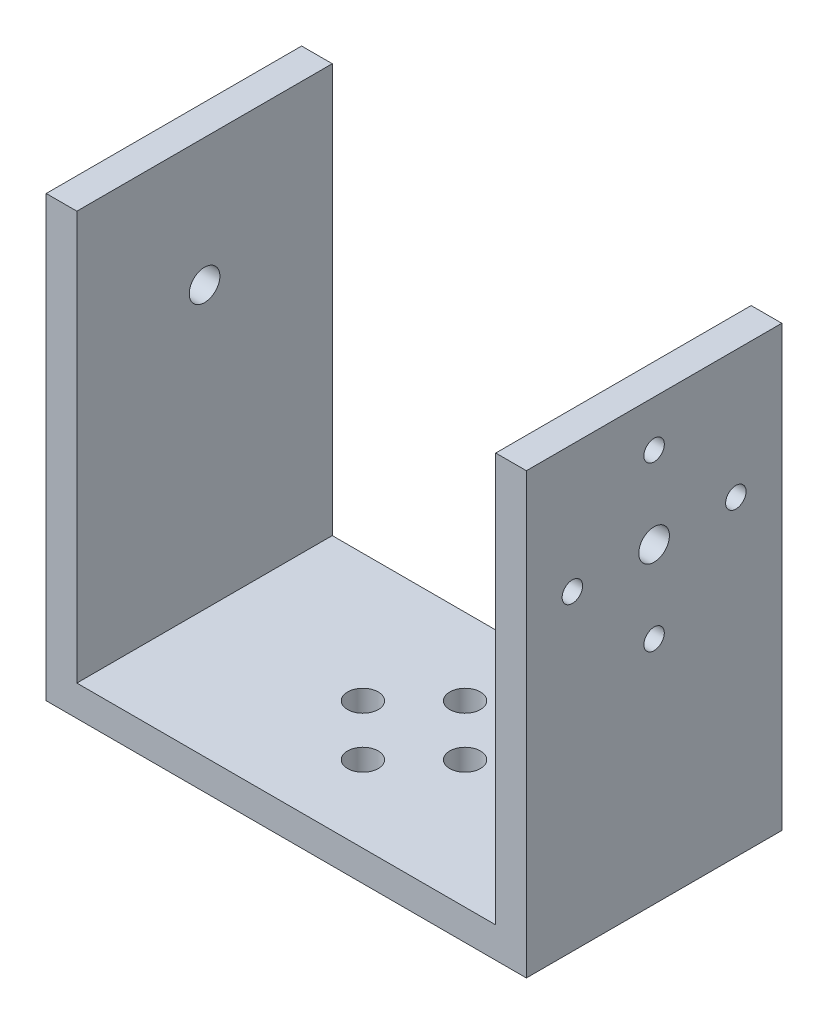
ISO-10303-21;
HEADER;
FILE_DESCRIPTION(('STEP AP214'),'2;1');
FILE_NAME('part.step','',(''),(''),'','','');
FILE_SCHEMA(('AUTOMOTIVE_DESIGN { 1 0 10303 214 1 1 1 1 }'));
ENDSEC;
DATA;
#1=APPLICATION_CONTEXT('core data for automotive mechanical design processes');
#2=APPLICATION_PROTOCOL_DEFINITION('international standard','automotive_design',2000,#1);
#3=PRODUCT_CONTEXT('',#1,'mechanical');
#4=PRODUCT('Part','Part','',(#3));
#5=PRODUCT_RELATED_PRODUCT_CATEGORY('part','',(#4));
#6=PRODUCT_DEFINITION_FORMATION('','',#4);
#7=PRODUCT_DEFINITION_CONTEXT('part definition',#1,'design');
#8=PRODUCT_DEFINITION('design','',#6,#7);
#9=PRODUCT_DEFINITION_SHAPE('','',#8);
#10=(LENGTH_UNIT() NAMED_UNIT(*) SI_UNIT(.MILLI.,.METRE.));
#11=(NAMED_UNIT(*) PLANE_ANGLE_UNIT() SI_UNIT($,.RADIAN.));
#12=(NAMED_UNIT(*) SI_UNIT($,.STERADIAN.) SOLID_ANGLE_UNIT());
#13=UNCERTAINTY_MEASURE_WITH_UNIT(LENGTH_MEASURE(1.E-05),#10,'distance_accuracy_value','');
#14=(GEOMETRIC_REPRESENTATION_CONTEXT(3) GLOBAL_UNCERTAINTY_ASSIGNED_CONTEXT((#13)) GLOBAL_UNIT_ASSIGNED_CONTEXT((#10,
#11,#12)) REPRESENTATION_CONTEXT('',''));
#15=CARTESIAN_POINT('',(0.,0.,0.));
#16=DIRECTION('',(0.,0.,1.));
#17=DIRECTION('',(1.,0.,0.));
#18=AXIS2_PLACEMENT_3D('',#15,#16,#17);
#19=CARTESIAN_POINT('',(0.,0.,0.));
#20=DIRECTION('',(1.,0.,0.));
#21=DIRECTION('',(0.,0.,-1.));
#22=AXIS2_PLACEMENT_3D('',#19,#20,#21);
#23=CYLINDRICAL_SURFACE('',#22,1.5);
#24=CARTESIAN_POINT('',(0.,0.,0.));
#25=DIRECTION('',(1.,0.,0.));
#26=DIRECTION('',(0.,0.,-1.));
#27=AXIS2_PLACEMENT_3D('',#24,#25,#26);
#28=CIRCLE('',#27,1.5);
#29=CARTESIAN_POINT('',(0.,0.,-1.5));
#30=VERTEX_POINT('',#29);
#31=EDGE_CURVE('E20',#30,#30,#28,.F.);
#32=ORIENTED_EDGE('',*,*,#31,.T.);
#33=EDGE_LOOP('',(#32));
#34=FACE_BOUND('',#33,.T.);
#35=CARTESIAN_POINT('',(3.,0.,0.));
#36=DIRECTION('',(1.,0.,0.));
#37=DIRECTION('',(0.,0.,-1.));
#38=AXIS2_PLACEMENT_3D('',#35,#36,#37);
#39=CIRCLE('',#38,1.5);
#40=CARTESIAN_POINT('',(3.,0.,-1.5));
#41=VERTEX_POINT('',#40);
#42=EDGE_CURVE('E113',#41,#41,#39,.F.);
#43=ORIENTED_EDGE('',*,*,#42,.F.);
#44=EDGE_LOOP('',(#43));
#45=FACE_BOUND('',#44,.T.);
#46=ADVANCED_FACE('F17',(#34,#45),#23,.F.);
#47=CARTESIAN_POINT('',(0.,8.,0.));
#48=DIRECTION('',(1.,0.,0.));
#49=DIRECTION('',(0.,0.,-1.));
#50=AXIS2_PLACEMENT_3D('',#47,#48,#49);
#51=CYLINDRICAL_SURFACE('',#50,1.);
#52=CARTESIAN_POINT('',(0.,8.,0.));
#53=DIRECTION('',(1.,0.,0.));
#54=DIRECTION('',(0.,0.,-1.));
#55=AXIS2_PLACEMENT_3D('',#52,#53,#54);
#56=CIRCLE('',#55,1.);
#57=CARTESIAN_POINT('',(0.,8.,-1.));
#58=VERTEX_POINT('',#57);
#59=EDGE_CURVE('E168',#58,#58,#56,.F.);
#60=ORIENTED_EDGE('',*,*,#59,.T.);
#61=EDGE_LOOP('',(#60));
#62=FACE_BOUND('',#61,.T.);
#63=CARTESIAN_POINT('',(3.,8.,0.));
#64=DIRECTION('',(1.,0.,0.));
#65=DIRECTION('',(0.,0.,-1.));
#66=AXIS2_PLACEMENT_3D('',#63,#64,#65);
#67=CIRCLE('',#66,1.);
#68=CARTESIAN_POINT('',(3.,8.,-1.));
#69=VERTEX_POINT('',#68);
#70=EDGE_CURVE('E154',#69,#69,#67,.F.);
#71=ORIENTED_EDGE('',*,*,#70,.F.);
#72=EDGE_LOOP('',(#71));
#73=FACE_BOUND('',#72,.T.);
#74=ADVANCED_FACE('F402',(#62,#73),#51,.F.);
#75=CARTESIAN_POINT('',(0.,0.,-8.));
#76=DIRECTION('',(1.,0.,0.));
#77=DIRECTION('',(0.,0.,-1.));
#78=AXIS2_PLACEMENT_3D('',#75,#76,#77);
#79=CYLINDRICAL_SURFACE('',#78,1.);
#80=CARTESIAN_POINT('',(0.,0.,-8.));
#81=DIRECTION('',(1.,0.,0.));
#82=DIRECTION('',(0.,0.,-1.));
#83=AXIS2_PLACEMENT_3D('',#80,#81,#82);
#84=CIRCLE('',#83,1.);
#85=CARTESIAN_POINT('',(0.,0.,-9.));
#86=VERTEX_POINT('',#85);
#87=EDGE_CURVE('E166',#86,#86,#84,.F.);
#88=ORIENTED_EDGE('',*,*,#87,.T.);
#89=EDGE_LOOP('',(#88));
#90=FACE_BOUND('',#89,.T.);
#91=CARTESIAN_POINT('',(3.,0.,-8.));
#92=DIRECTION('',(1.,0.,0.));
#93=DIRECTION('',(0.,0.,-1.));
#94=AXIS2_PLACEMENT_3D('',#91,#92,#93);
#95=CIRCLE('',#94,1.);
#96=CARTESIAN_POINT('',(3.,0.,-9.));
#97=VERTEX_POINT('',#96);
#98=EDGE_CURVE('E151',#97,#97,#95,.F.);
#99=ORIENTED_EDGE('',*,*,#98,.F.);
#100=EDGE_LOOP('',(#99));
#101=FACE_BOUND('',#100,.T.);
#102=ADVANCED_FACE('F393',(#90,#101),#79,.F.);
#103=CARTESIAN_POINT('',(0.,-8.,0.));
#104=DIRECTION('',(1.,0.,0.));
#105=DIRECTION('',(0.,0.,-1.));
#106=AXIS2_PLACEMENT_3D('',#103,#104,#105);
#107=CYLINDRICAL_SURFACE('',#106,1.);
#108=CARTESIAN_POINT('',(0.,-8.,0.));
#109=DIRECTION('',(1.,0.,0.));
#110=DIRECTION('',(0.,0.,-1.));
#111=AXIS2_PLACEMENT_3D('',#108,#109,#110);
#112=CIRCLE('',#111,1.);
#113=CARTESIAN_POINT('',(0.,-8.,-1.));
#114=VERTEX_POINT('',#113);
#115=EDGE_CURVE('E163',#114,#114,#112,.F.);
#116=ORIENTED_EDGE('',*,*,#115,.T.);
#117=EDGE_LOOP('',(#116));
#118=FACE_BOUND('',#117,.T.);
#119=CARTESIAN_POINT('',(3.,-8.,0.));
#120=DIRECTION('',(1.,0.,0.));
#121=DIRECTION('',(0.,0.,-1.));
#122=AXIS2_PLACEMENT_3D('',#119,#120,#121);
#123=CIRCLE('',#122,1.);
#124=CARTESIAN_POINT('',(3.,-8.,-1.));
#125=VERTEX_POINT('',#124);
#126=EDGE_CURVE('E109',#125,#125,#123,.F.);
#127=ORIENTED_EDGE('',*,*,#126,.F.);
#128=EDGE_LOOP('',(#127));
#129=FACE_BOUND('',#128,.T.);
#130=ADVANCED_FACE('F384',(#118,#129),#107,.F.);
#131=CARTESIAN_POINT('',(0.,0.,8.));
#132=DIRECTION('',(1.,0.,0.));
#133=DIRECTION('',(0.,0.,-1.));
#134=AXIS2_PLACEMENT_3D('',#131,#132,#133);
#135=CYLINDRICAL_SURFACE('',#134,1.);
#136=CARTESIAN_POINT('',(0.,0.,8.));
#137=DIRECTION('',(1.,0.,0.));
#138=DIRECTION('',(0.,0.,-1.));
#139=AXIS2_PLACEMENT_3D('',#136,#137,#138);
#140=CIRCLE('',#139,1.);
#141=CARTESIAN_POINT('',(0.,0.,7.));
#142=VERTEX_POINT('',#141);
#143=EDGE_CURVE('E120',#142,#142,#140,.F.);
#144=ORIENTED_EDGE('',*,*,#143,.T.);
#145=EDGE_LOOP('',(#144));
#146=FACE_BOUND('',#145,.T.);
#147=CARTESIAN_POINT('',(3.,0.,8.));
#148=DIRECTION('',(1.,0.,0.));
#149=DIRECTION('',(0.,0.,-1.));
#150=AXIS2_PLACEMENT_3D('',#147,#148,#149);
#151=CIRCLE('',#150,1.);
#152=CARTESIAN_POINT('',(3.,0.,7.));
#153=VERTEX_POINT('',#152);
#154=EDGE_CURVE('E106',#153,#153,#151,.F.);
#155=ORIENTED_EDGE('',*,*,#154,.F.);
#156=EDGE_LOOP('',(#155));
#157=FACE_BOUND('',#156,.T.);
#158=ADVANCED_FACE('F190',(#146,#157),#135,.F.);
#159=CARTESIAN_POINT('',(-44.,0.,0.));
#160=DIRECTION('',(1.,0.,0.));
#161=DIRECTION('',(0.,0.,-1.));
#162=AXIS2_PLACEMENT_3D('',#159,#160,#161);
#163=CYLINDRICAL_SURFACE('',#162,1.5);
#164=CARTESIAN_POINT('',(-44.,0.,0.));
#165=DIRECTION('',(1.,0.,0.));
#166=DIRECTION('',(0.,0.,-1.));
#167=AXIS2_PLACEMENT_3D('',#164,#165,#166);
#168=CIRCLE('',#167,1.5);
#169=CARTESIAN_POINT('',(-44.,0.,-1.5));
#170=VERTEX_POINT('',#169);
#171=EDGE_CURVE('E145',#170,#170,#168,.T.);
#172=ORIENTED_EDGE('',*,*,#171,.F.);
#173=EDGE_LOOP('',(#172));
#174=FACE_BOUND('',#173,.T.);
#175=CARTESIAN_POINT('',(-41.,0.,0.));
#176=DIRECTION('',(1.,0.,0.));
#177=DIRECTION('',(0.,0.,-1.));
#178=AXIS2_PLACEMENT_3D('',#175,#176,#177);
#179=CIRCLE('',#178,1.5);
#180=CARTESIAN_POINT('',(-41.,0.,-1.5));
#181=VERTEX_POINT('',#180);
#182=EDGE_CURVE('E116',#181,#181,#179,.F.);
#183=ORIENTED_EDGE('',*,*,#182,.F.);
#184=EDGE_LOOP('',(#183));
#185=FACE_BOUND('',#184,.T.);
#186=ADVANCED_FACE('F179',(#174,#185),#163,.F.);
#187=CARTESIAN_POINT('',(0.,-7.50000000000001,0.));
#188=DIRECTION('',(1.,0.,0.));
#189=DIRECTION('',(0.,0.,-1.));
#190=AXIS2_PLACEMENT_3D('',#187,#188,#189);
#191=PLANE('',#190);
#192=ORIENTED_EDGE('',*,*,#143,.F.);
#193=EDGE_LOOP('',(#192));
#194=FACE_BOUND('',#193,.T.);
#195=ORIENTED_EDGE('',*,*,#115,.F.);
#196=EDGE_LOOP('',(#195));
#197=FACE_BOUND('',#196,.T.);
#198=ORIENTED_EDGE('',*,*,#87,.F.);
#199=EDGE_LOOP('',(#198));
#200=FACE_BOUND('',#199,.T.);
#201=ORIENTED_EDGE('',*,*,#59,.F.);
#202=EDGE_LOOP('',(#201));
#203=FACE_BOUND('',#202,.T.);
#204=ORIENTED_EDGE('',*,*,#31,.F.);
#205=EDGE_LOOP('',(#204));
#206=FACE_BOUND('',#205,.T.);
#207=DIRECTION('',(0.,0.,1.));
#208=VECTOR('',#207,1.);
#209=CARTESIAN_POINT('',(0.,-27.5,12.5));
#210=LINE('',#209,#208);
#211=CARTESIAN_POINT('',(0.,-27.5,12.5));
#212=VERTEX_POINT('',#211);
#213=CARTESIAN_POINT('',(0.,-27.5,-12.5));
#214=VERTEX_POINT('',#213);
#215=EDGE_CURVE('E82',#212,#214,#210,.F.);
#216=ORIENTED_EDGE('',*,*,#215,.F.);
#217=DIRECTION('',(0.,-1.,0.));
#218=VECTOR('',#217,1.);
#219=CARTESIAN_POINT('',(0.,12.5,12.5));
#220=LINE('',#219,#218);
#221=CARTESIAN_POINT('',(0.,12.5,12.5));
#222=VERTEX_POINT('',#221);
#223=EDGE_CURVE('E79',#222,#212,#220,.T.);
#224=ORIENTED_EDGE('',*,*,#223,.F.);
#225=DIRECTION('',(0.,0.,1.));
#226=VECTOR('',#225,1.);
#227=CARTESIAN_POINT('',(0.,12.5,-12.5));
#228=LINE('',#227,#226);
#229=CARTESIAN_POINT('',(0.,12.5,-12.5));
#230=VERTEX_POINT('',#229);
#231=EDGE_CURVE('E119',#230,#222,#228,.T.);
#232=ORIENTED_EDGE('',*,*,#231,.F.);
#233=DIRECTION('',(0.,1.,0.));
#234=VECTOR('',#233,1.);
#235=CARTESIAN_POINT('',(0.,-27.5,-12.5));
#236=LINE('',#235,#234);
#237=EDGE_CURVE('E86',#214,#230,#236,.T.);
#238=ORIENTED_EDGE('',*,*,#237,.F.);
#239=EDGE_LOOP('',(#216,#224,#232,#238));
#240=FACE_BOUND('',#239,.T.);
#241=ADVANCED_FACE('F84',(#194,#197,#200,#203,#206,#240),#191,.F.);
#242=CARTESIAN_POINT('',(0.,12.5,-12.5));
#243=DIRECTION('',(0.,1.,0.));
#244=DIRECTION('',(0.,0.,1.));
#245=AXIS2_PLACEMENT_3D('',#242,#243,#244);
#246=PLANE('',#245);
#247=DIRECTION('',(0.,0.,-1.));
#248=VECTOR('',#247,1.);
#249=CARTESIAN_POINT('',(3.,12.5,0.));
#250=LINE('',#249,#248);
#251=CARTESIAN_POINT('',(3.,12.5,-12.5));
#252=VERTEX_POINT('',#251);
#253=CARTESIAN_POINT('',(3.,12.5,12.5));
#254=VERTEX_POINT('',#253);
#255=EDGE_CURVE('E90',#252,#254,#250,.F.);
#256=ORIENTED_EDGE('',*,*,#255,.F.);
#257=DIRECTION('',(-1.,0.,0.));
#258=VECTOR('',#257,1.);
#259=CARTESIAN_POINT('',(0.,12.5,-12.5));
#260=LINE('',#259,#258);
#261=EDGE_CURVE('E262',#230,#252,#260,.F.);
#262=ORIENTED_EDGE('',*,*,#261,.F.);
#263=ORIENTED_EDGE('',*,*,#231,.T.);
#264=DIRECTION('',(1.,0.,0.));
#265=VECTOR('',#264,1.);
#266=CARTESIAN_POINT('',(0.,12.5,12.5));
#267=LINE('',#266,#265);
#268=EDGE_CURVE('E105',#254,#222,#267,.F.);
#269=ORIENTED_EDGE('',*,*,#268,.F.);
#270=EDGE_LOOP('',(#256,#262,#263,#269));
#271=FACE_BOUND('',#270,.T.);
#272=ADVANCED_FACE('F178',(#271),#246,.T.);
#273=CARTESIAN_POINT('',(-44.,12.5,-12.5));
#274=DIRECTION('',(0.,1.,0.));
#275=DIRECTION('',(0.,0.,1.));
#276=AXIS2_PLACEMENT_3D('',#273,#274,#275);
#277=PLANE('',#276);
#278=DIRECTION('',(0.,0.,-1.));
#279=VECTOR('',#278,1.);
#280=CARTESIAN_POINT('',(-41.,12.5,0.));
#281=LINE('',#280,#279);
#282=CARTESIAN_POINT('',(-41.,12.5,-12.5));
#283=VERTEX_POINT('',#282);
#284=CARTESIAN_POINT('',(-41.,12.5,12.5));
#285=VERTEX_POINT('',#284);
#286=EDGE_CURVE('E117',#283,#285,#281,.F.);
#287=ORIENTED_EDGE('',*,*,#286,.F.);
#288=DIRECTION('',(-1.,0.,0.));
#289=VECTOR('',#288,1.);
#290=CARTESIAN_POINT('',(0.,12.5,-12.5));
#291=LINE('',#290,#289);
#292=CARTESIAN_POINT('',(-44.,12.5,-12.5));
#293=VERTEX_POINT('',#292);
#294=EDGE_CURVE('E249',#293,#283,#291,.F.);
#295=ORIENTED_EDGE('',*,*,#294,.F.);
#296=DIRECTION('',(0.,0.,1.));
#297=VECTOR('',#296,1.);
#298=CARTESIAN_POINT('',(-44.,12.5,0.));
#299=LINE('',#298,#297);
#300=CARTESIAN_POINT('',(-44.,12.5,12.5));
#301=VERTEX_POINT('',#300);
#302=EDGE_CURVE('E147',#301,#293,#299,.F.);
#303=ORIENTED_EDGE('',*,*,#302,.F.);
#304=DIRECTION('',(1.,0.,0.));
#305=VECTOR('',#304,1.);
#306=CARTESIAN_POINT('',(0.,12.5,12.5));
#307=LINE('',#306,#305);
#308=EDGE_CURVE('E250',#285,#301,#307,.F.);
#309=ORIENTED_EDGE('',*,*,#308,.F.);
#310=EDGE_LOOP('',(#287,#295,#303,#309));
#311=FACE_BOUND('',#310,.T.);
#312=ADVANCED_FACE('F187',(#311),#277,.T.);
#313=CARTESIAN_POINT('',(-41.,-7.5,0.));
#314=DIRECTION('',(1.,0.,0.));
#315=DIRECTION('',(0.,0.,-1.));
#316=AXIS2_PLACEMENT_3D('',#313,#314,#315);
#317=PLANE('',#316);
#318=ORIENTED_EDGE('',*,*,#182,.T.);
#319=EDGE_LOOP('',(#318));
#320=FACE_BOUND('',#319,.T.);
#321=DIRECTION('',(0.,0.,1.));
#322=VECTOR('',#321,1.);
#323=CARTESIAN_POINT('',(-41.,-27.5,12.5));
#324=LINE('',#323,#322);
#325=CARTESIAN_POINT('',(-41.,-27.5,-12.5));
#326=VERTEX_POINT('',#325);
#327=CARTESIAN_POINT('',(-41.,-27.5,12.5));
#328=VERTEX_POINT('',#327);
#329=EDGE_CURVE('E91',#326,#328,#324,.T.);
#330=ORIENTED_EDGE('',*,*,#329,.F.);
#331=DIRECTION('',(0.,1.,0.));
#332=VECTOR('',#331,1.);
#333=CARTESIAN_POINT('',(-41.,-27.5,-12.5));
#334=LINE('',#333,#332);
#335=EDGE_CURVE('E253',#283,#326,#334,.F.);
#336=ORIENTED_EDGE('',*,*,#335,.F.);
#337=ORIENTED_EDGE('',*,*,#286,.T.);
#338=DIRECTION('',(0.,-1.,0.));
#339=VECTOR('',#338,1.);
#340=CARTESIAN_POINT('',(-41.,12.5,12.5));
#341=LINE('',#340,#339);
#342=EDGE_CURVE('E99',#328,#285,#341,.F.);
#343=ORIENTED_EDGE('',*,*,#342,.F.);
#344=EDGE_LOOP('',(#330,#336,#337,#343));
#345=FACE_BOUND('',#344,.T.);
#346=ADVANCED_FACE('F235',(#320,#345),#317,.T.);
#347=CARTESIAN_POINT('',(3.,-27.5,12.5));
#348=DIRECTION('',(0.,1.,0.));
#349=DIRECTION('',(0.,0.,1.));
#350=AXIS2_PLACEMENT_3D('',#347,#348,#349);
#351=PLANE('',#350);
#352=CARTESIAN_POINT('',(-15.5,-27.5,0.));
#353=DIRECTION('',(0.,1.,0.));
#354=DIRECTION('',(0.,0.,1.));
#355=AXIS2_PLACEMENT_3D('',#352,#353,#354);
#356=CIRCLE('',#355,1.5);
#357=CARTESIAN_POINT('',(-15.5,-27.5,1.5));
#358=VERTEX_POINT('',#357);
#359=EDGE_CURVE('E131',#358,#358,#356,.F.);
#360=ORIENTED_EDGE('',*,*,#359,.T.);
#361=EDGE_LOOP('',(#360));
#362=FACE_BOUND('',#361,.T.);
#363=CARTESIAN_POINT('',(-25.5,-27.5,0.));
#364=DIRECTION('',(0.,1.,0.));
#365=DIRECTION('',(0.,0.,1.));
#366=AXIS2_PLACEMENT_3D('',#363,#364,#365);
#367=CIRCLE('',#366,1.5);
#368=CARTESIAN_POINT('',(-25.5,-27.5,1.49999999999999));
#369=VERTEX_POINT('',#368);
#370=EDGE_CURVE('E135',#369,#369,#367,.F.);
#371=ORIENTED_EDGE('',*,*,#370,.T.);
#372=EDGE_LOOP('',(#371));
#373=FACE_BOUND('',#372,.T.);
#374=CARTESIAN_POINT('',(-20.5,-27.5,5.));
#375=DIRECTION('',(0.,1.,0.));
#376=DIRECTION('',(0.,0.,1.));
#377=AXIS2_PLACEMENT_3D('',#374,#375,#376);
#378=CIRCLE('',#377,1.5);
#379=CARTESIAN_POINT('',(-20.5,-27.5,6.5));
#380=VERTEX_POINT('',#379);
#381=EDGE_CURVE('E138',#380,#380,#378,.F.);
#382=ORIENTED_EDGE('',*,*,#381,.T.);
#383=EDGE_LOOP('',(#382));
#384=FACE_BOUND('',#383,.T.);
#385=CARTESIAN_POINT('',(-20.5,-27.5,-5.));
#386=DIRECTION('',(0.,1.,0.));
#387=DIRECTION('',(0.,0.,1.));
#388=AXIS2_PLACEMENT_3D('',#385,#386,#387);
#389=CIRCLE('',#388,1.5);
#390=CARTESIAN_POINT('',(-20.5,-27.5,-3.5));
#391=VERTEX_POINT('',#390);
#392=EDGE_CURVE('E141',#391,#391,#389,.F.);
#393=ORIENTED_EDGE('',*,*,#392,.T.);
#394=EDGE_LOOP('',(#393));
#395=FACE_BOUND('',#394,.T.);
#396=ORIENTED_EDGE('',*,*,#215,.T.);
#397=DIRECTION('',(-1.,0.,0.));
#398=VECTOR('',#397,1.);
#399=CARTESIAN_POINT('',(0.,-27.5,-12.5));
#400=LINE('',#399,#398);
#401=EDGE_CURVE('E144',#326,#214,#400,.F.);
#402=ORIENTED_EDGE('',*,*,#401,.F.);
#403=ORIENTED_EDGE('',*,*,#329,.T.);
#404=DIRECTION('',(1.,0.,0.));
#405=VECTOR('',#404,1.);
#406=CARTESIAN_POINT('',(0.,-27.5,12.5));
#407=LINE('',#406,#405);
#408=EDGE_CURVE('E94',#212,#328,#407,.F.);
#409=ORIENTED_EDGE('',*,*,#408,.F.);
#410=EDGE_LOOP('',(#396,#402,#403,#409));
#411=FACE_BOUND('',#410,.T.);
#412=ADVANCED_FACE('F95',(#362,#373,#384,#395,#411),#351,.T.);
#413=CARTESIAN_POINT('',(3.,-7.50000000000001,0.));
#414=DIRECTION('',(1.,0.,0.));
#415=DIRECTION('',(0.,0.,-1.));
#416=AXIS2_PLACEMENT_3D('',#413,#414,#415);
#417=PLANE('',#416);
#418=ORIENTED_EDGE('',*,*,#154,.T.);
#419=EDGE_LOOP('',(#418));
#420=FACE_BOUND('',#419,.T.);
#421=ORIENTED_EDGE('',*,*,#126,.T.);
#422=EDGE_LOOP('',(#421));
#423=FACE_BOUND('',#422,.T.);
#424=ORIENTED_EDGE('',*,*,#98,.T.);
#425=EDGE_LOOP('',(#424));
#426=FACE_BOUND('',#425,.T.);
#427=ORIENTED_EDGE('',*,*,#70,.T.);
#428=EDGE_LOOP('',(#427));
#429=FACE_BOUND('',#428,.T.);
#430=ORIENTED_EDGE('',*,*,#42,.T.);
#431=EDGE_LOOP('',(#430));
#432=FACE_BOUND('',#431,.T.);
#433=DIRECTION('',(0.,-1.,0.));
#434=VECTOR('',#433,1.);
#435=CARTESIAN_POINT('',(3.,12.5,12.5));
#436=LINE('',#435,#434);
#437=CARTESIAN_POINT('',(3.,-30.5,12.5));
#438=VERTEX_POINT('',#437);
#439=EDGE_CURVE('E271',#438,#254,#436,.F.);
#440=ORIENTED_EDGE('',*,*,#439,.F.);
#441=DIRECTION('',(0.,0.,-1.));
#442=VECTOR('',#441,1.);
#443=CARTESIAN_POINT('',(3.,-30.5,-12.5));
#444=LINE('',#443,#442);
#445=CARTESIAN_POINT('',(3.,-30.5,-12.5));
#446=VERTEX_POINT('',#445);
#447=EDGE_CURVE('E134',#446,#438,#444,.F.);
#448=ORIENTED_EDGE('',*,*,#447,.F.);
#449=DIRECTION('',(0.,1.,0.));
#450=VECTOR('',#449,1.);
#451=CARTESIAN_POINT('',(3.,-27.5,-12.5));
#452=LINE('',#451,#450);
#453=EDGE_CURVE('E256',#252,#446,#452,.F.);
#454=ORIENTED_EDGE('',*,*,#453,.F.);
#455=ORIENTED_EDGE('',*,*,#255,.T.);
#456=EDGE_LOOP('',(#440,#448,#454,#455));
#457=FACE_BOUND('',#456,.T.);
#458=ADVANCED_FACE('F229',(#420,#423,#426,#429,#432,#457),#417,.T.);
#459=CARTESIAN_POINT('',(0.,12.5,12.5));
#460=DIRECTION('',(0.,0.,1.));
#461=DIRECTION('',(0.,-1.,0.));
#462=AXIS2_PLACEMENT_3D('',#459,#460,#461);
#463=PLANE('',#462);
#464=ORIENTED_EDGE('',*,*,#439,.T.);
#465=ORIENTED_EDGE('',*,*,#268,.T.);
#466=ORIENTED_EDGE('',*,*,#223,.T.);
#467=ORIENTED_EDGE('',*,*,#408,.T.);
#468=ORIENTED_EDGE('',*,*,#342,.T.);
#469=ORIENTED_EDGE('',*,*,#308,.T.);
#470=DIRECTION('',(0.,1.,0.));
#471=VECTOR('',#470,1.);
#472=CARTESIAN_POINT('',(-44.,-29.,12.5));
#473=LINE('',#472,#471);
#474=CARTESIAN_POINT('',(-44.,-30.5,12.5));
#475=VERTEX_POINT('',#474);
#476=EDGE_CURVE('E267',#475,#301,#473,.T.);
#477=ORIENTED_EDGE('',*,*,#476,.F.);
#478=DIRECTION('',(1.,0.,0.));
#479=VECTOR('',#478,1.);
#480=CARTESIAN_POINT('',(3.,-30.5,12.5));
#481=LINE('',#480,#479);
#482=EDGE_CURVE('E279',#438,#475,#481,.F.);
#483=ORIENTED_EDGE('',*,*,#482,.F.);
#484=EDGE_LOOP('',(#464,#465,#466,#467,#468,#469,#477,#483));
#485=FACE_BOUND('',#484,.T.);
#486=ADVANCED_FACE('F103',(#485),#463,.T.);
#487=CARTESIAN_POINT('',(-44.,-29.,0.));
#488=DIRECTION('',(-1.,0.,0.));
#489=DIRECTION('',(0.,0.,1.));
#490=AXIS2_PLACEMENT_3D('',#487,#488,#489);
#491=PLANE('',#490);
#492=ORIENTED_EDGE('',*,*,#171,.T.);
#493=EDGE_LOOP('',(#492));
#494=FACE_BOUND('',#493,.T.);
#495=ORIENTED_EDGE('',*,*,#476,.T.);
#496=ORIENTED_EDGE('',*,*,#302,.T.);
#497=DIRECTION('',(0.,1.,0.));
#498=VECTOR('',#497,1.);
#499=CARTESIAN_POINT('',(-44.,-27.5,-12.5));
#500=LINE('',#499,#498);
#501=CARTESIAN_POINT('',(-44.,-30.5,-12.5));
#502=VERTEX_POINT('',#501);
#503=EDGE_CURVE('E35',#502,#293,#500,.T.);
#504=ORIENTED_EDGE('',*,*,#503,.F.);
#505=DIRECTION('',(0.,0.,-1.));
#506=VECTOR('',#505,1.);
#507=CARTESIAN_POINT('',(-44.,-30.5,-12.5));
#508=LINE('',#507,#506);
#509=EDGE_CURVE('E275',#475,#502,#508,.T.);
#510=ORIENTED_EDGE('',*,*,#509,.F.);
#511=EDGE_LOOP('',(#495,#496,#504,#510));
#512=FACE_BOUND('',#511,.T.);
#513=ADVANCED_FACE('F222',(#494,#512),#491,.T.);
#514=CARTESIAN_POINT('',(0.,-27.5,-12.5));
#515=DIRECTION('',(0.,0.,-1.));
#516=DIRECTION('',(-1.,0.,0.));
#517=AXIS2_PLACEMENT_3D('',#514,#515,#516);
#518=PLANE('',#517);
#519=ORIENTED_EDGE('',*,*,#335,.T.);
#520=ORIENTED_EDGE('',*,*,#401,.T.);
#521=ORIENTED_EDGE('',*,*,#237,.T.);
#522=ORIENTED_EDGE('',*,*,#261,.T.);
#523=ORIENTED_EDGE('',*,*,#453,.T.);
#524=DIRECTION('',(1.,0.,0.));
#525=VECTOR('',#524,1.);
#526=CARTESIAN_POINT('',(3.,-30.5,-12.5));
#527=LINE('',#526,#525);
#528=EDGE_CURVE('E130',#502,#446,#527,.T.);
#529=ORIENTED_EDGE('',*,*,#528,.F.);
#530=ORIENTED_EDGE('',*,*,#503,.T.);
#531=ORIENTED_EDGE('',*,*,#294,.T.);
#532=EDGE_LOOP('',(#519,#520,#521,#522,#523,#529,#530,#531));
#533=FACE_BOUND('',#532,.T.);
#534=ADVANCED_FACE('F218',(#533),#518,.T.);
#535=CARTESIAN_POINT('',(-20.5,-30.5,-5.));
#536=DIRECTION('',(0.,1.,0.));
#537=DIRECTION('',(0.,0.,1.));
#538=AXIS2_PLACEMENT_3D('',#535,#536,#537);
#539=CYLINDRICAL_SURFACE('',#538,1.5);
#540=CARTESIAN_POINT('',(-20.5,-30.5,-5.));
#541=DIRECTION('',(0.,1.,0.));
#542=DIRECTION('',(0.,0.,1.));
#543=AXIS2_PLACEMENT_3D('',#540,#541,#542);
#544=CIRCLE('',#543,1.5);
#545=CARTESIAN_POINT('',(-20.5,-30.5,-3.5));
#546=VERTEX_POINT('',#545);
#547=EDGE_CURVE('E127',#546,#546,#544,.T.);
#548=ORIENTED_EDGE('',*,*,#547,.F.);
#549=EDGE_LOOP('',(#548));
#550=FACE_BOUND('',#549,.T.);
#551=ORIENTED_EDGE('',*,*,#392,.F.);
#552=EDGE_LOOP('',(#551));
#553=FACE_BOUND('',#552,.T.);
#554=ADVANCED_FACE('F214',(#550,#553),#539,.F.);
#555=CARTESIAN_POINT('',(-20.5,-30.5,5.));
#556=DIRECTION('',(0.,1.,0.));
#557=DIRECTION('',(0.,0.,1.));
#558=AXIS2_PLACEMENT_3D('',#555,#556,#557);
#559=CYLINDRICAL_SURFACE('',#558,1.5);
#560=CARTESIAN_POINT('',(-20.5,-30.5,5.));
#561=DIRECTION('',(0.,1.,0.));
#562=DIRECTION('',(0.,0.,1.));
#563=AXIS2_PLACEMENT_3D('',#560,#561,#562);
#564=CIRCLE('',#563,1.5);
#565=CARTESIAN_POINT('',(-20.5,-30.5,6.5));
#566=VERTEX_POINT('',#565);
#567=EDGE_CURVE('E124',#566,#566,#564,.T.);
#568=ORIENTED_EDGE('',*,*,#567,.F.);
#569=EDGE_LOOP('',(#568));
#570=FACE_BOUND('',#569,.T.);
#571=ORIENTED_EDGE('',*,*,#381,.F.);
#572=EDGE_LOOP('',(#571));
#573=FACE_BOUND('',#572,.T.);
#574=ADVANCED_FACE('F210',(#570,#573),#559,.F.);
#575=CARTESIAN_POINT('',(-25.5,-30.5,0.));
#576=DIRECTION('',(0.,1.,0.));
#577=DIRECTION('',(0.,0.,1.));
#578=AXIS2_PLACEMENT_3D('',#575,#576,#577);
#579=CYLINDRICAL_SURFACE('',#578,1.5);
#580=CARTESIAN_POINT('',(-25.5,-30.5,0.));
#581=DIRECTION('',(0.,1.,0.));
#582=DIRECTION('',(0.,0.,1.));
#583=AXIS2_PLACEMENT_3D('',#580,#581,#582);
#584=CIRCLE('',#583,1.5);
#585=CARTESIAN_POINT('',(-25.5,-30.5,1.49999999999999));
#586=VERTEX_POINT('',#585);
#587=EDGE_CURVE('E26',#586,#586,#584,.T.);
#588=ORIENTED_EDGE('',*,*,#587,.F.);
#589=EDGE_LOOP('',(#588));
#590=FACE_BOUND('',#589,.T.);
#591=ORIENTED_EDGE('',*,*,#370,.F.);
#592=EDGE_LOOP('',(#591));
#593=FACE_BOUND('',#592,.T.);
#594=ADVANCED_FACE('F203',(#590,#593),#579,.F.);
#595=CARTESIAN_POINT('',(-15.5,-30.5,0.));
#596=DIRECTION('',(0.,1.,0.));
#597=DIRECTION('',(0.,0.,1.));
#598=AXIS2_PLACEMENT_3D('',#595,#596,#597);
#599=CYLINDRICAL_SURFACE('',#598,1.5);
#600=CARTESIAN_POINT('',(-15.5,-30.5,0.));
#601=DIRECTION('',(0.,1.,0.));
#602=DIRECTION('',(0.,0.,1.));
#603=AXIS2_PLACEMENT_3D('',#600,#601,#602);
#604=CIRCLE('',#603,1.5);
#605=CARTESIAN_POINT('',(-15.5,-30.5,1.5));
#606=VERTEX_POINT('',#605);
#607=EDGE_CURVE('E11',#606,#606,#604,.T.);
#608=ORIENTED_EDGE('',*,*,#607,.F.);
#609=EDGE_LOOP('',(#608));
#610=FACE_BOUND('',#609,.T.);
#611=ORIENTED_EDGE('',*,*,#359,.F.);
#612=EDGE_LOOP('',(#611));
#613=FACE_BOUND('',#612,.T.);
#614=ADVANCED_FACE('F197',(#610,#613),#599,.F.);
#615=CARTESIAN_POINT('',(3.,-30.5,-12.5));
#616=DIRECTION('',(0.,-1.,0.));
#617=DIRECTION('',(0.,0.,-1.));
#618=AXIS2_PLACEMENT_3D('',#615,#616,#617);
#619=PLANE('',#618);
#620=ORIENTED_EDGE('',*,*,#607,.T.);
#621=EDGE_LOOP('',(#620));
#622=FACE_BOUND('',#621,.T.);
#623=ORIENTED_EDGE('',*,*,#587,.T.);
#624=EDGE_LOOP('',(#623));
#625=FACE_BOUND('',#624,.T.);
#626=ORIENTED_EDGE('',*,*,#567,.T.);
#627=EDGE_LOOP('',(#626));
#628=FACE_BOUND('',#627,.T.);
#629=ORIENTED_EDGE('',*,*,#547,.T.);
#630=EDGE_LOOP('',(#629));
#631=FACE_BOUND('',#630,.T.);
#632=ORIENTED_EDGE('',*,*,#509,.T.);
#633=ORIENTED_EDGE('',*,*,#528,.T.);
#634=ORIENTED_EDGE('',*,*,#447,.T.);
#635=ORIENTED_EDGE('',*,*,#482,.T.);
#636=EDGE_LOOP('',(#632,#633,#634,#635));
#637=FACE_BOUND('',#636,.T.);
#638=ADVANCED_FACE('F195',(#622,#625,#628,#631,#637),#619,.T.);
#639=CLOSED_SHELL('',(#46,#74,#102,#130,#158,#186,#241,#272,#312,#346,#412,#458,#486,#513,#534,
#554,#574,#594,#614,#638));
#640=MANIFOLD_SOLID_BREP('B1',#639);
#641=ADVANCED_BREP_SHAPE_REPRESENTATION('',(#18,#640),#14);
#642=SHAPE_DEFINITION_REPRESENTATION(#9,#641);
ENDSEC;
END-ISO-10303-21;
